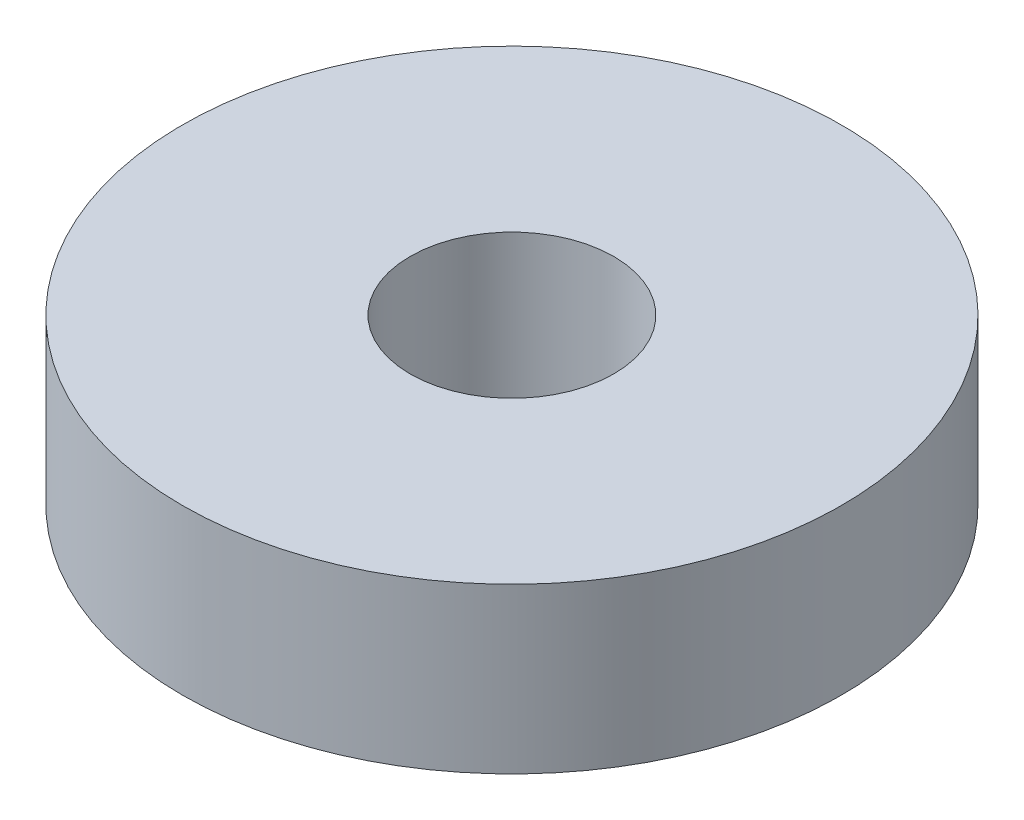
ISO-10303-21;
HEADER;
FILE_DESCRIPTION(('STEP AP214'),'2;1');
FILE_NAME('part.step','',(''),(''),'','','');
FILE_SCHEMA(('AUTOMOTIVE_DESIGN { 1 0 10303 214 1 1 1 1 }'));
ENDSEC;
DATA;
#1=APPLICATION_CONTEXT('core data for automotive mechanical design processes');
#2=APPLICATION_PROTOCOL_DEFINITION('international standard','automotive_design',2000,#1);
#3=PRODUCT_CONTEXT('',#1,'mechanical');
#4=PRODUCT('Part','Part','',(#3));
#5=PRODUCT_RELATED_PRODUCT_CATEGORY('part','',(#4));
#6=PRODUCT_DEFINITION_FORMATION('','',#4);
#7=PRODUCT_DEFINITION_CONTEXT('part definition',#1,'design');
#8=PRODUCT_DEFINITION('design','',#6,#7);
#9=PRODUCT_DEFINITION_SHAPE('','',#8);
#10=(LENGTH_UNIT() NAMED_UNIT(*) SI_UNIT(.MILLI.,.METRE.));
#11=(NAMED_UNIT(*) PLANE_ANGLE_UNIT() SI_UNIT($,.RADIAN.));
#12=(NAMED_UNIT(*) SI_UNIT($,.STERADIAN.) SOLID_ANGLE_UNIT());
#13=UNCERTAINTY_MEASURE_WITH_UNIT(LENGTH_MEASURE(1.E-05),#10,'distance_accuracy_value','');
#14=(GEOMETRIC_REPRESENTATION_CONTEXT(3) GLOBAL_UNCERTAINTY_ASSIGNED_CONTEXT((#13)) GLOBAL_UNIT_ASSIGNED_CONTEXT((#10,
#11,#12)) REPRESENTATION_CONTEXT('',''));
#15=CARTESIAN_POINT('',(0.,0.,0.));
#16=DIRECTION('',(0.,0.,1.));
#17=DIRECTION('',(1.,0.,0.));
#18=AXIS2_PLACEMENT_3D('',#15,#16,#17);
#19=CARTESIAN_POINT('',(0.,10.287,0.));
#20=DIRECTION('',(0.,1.,0.));
#21=DIRECTION('',(0.,0.,1.));
#22=AXIS2_PLACEMENT_3D('',#19,#20,#21);
#23=PLANE('',#22);
#24=CARTESIAN_POINT('',(0.,10.287,0.));
#25=DIRECTION('',(0.,1.,0.));
#26=DIRECTION('',(0.,0.,1.));
#27=AXIS2_PLACEMENT_3D('',#24,#25,#26);
#28=CIRCLE('',#27,20.6375);
#29=CARTESIAN_POINT('',(0.,10.287,20.6375));
#30=VERTEX_POINT('',#29);
#31=EDGE_CURVE('E10',#30,#30,#28,.T.);
#32=ORIENTED_EDGE('',*,*,#31,.T.);
#33=EDGE_LOOP('',(#32));
#34=FACE_BOUND('',#33,.T.);
#35=CARTESIAN_POINT('',(0.,10.287,0.));
#36=DIRECTION('',(0.,1.,0.));
#37=DIRECTION('',(0.,0.,1.));
#38=AXIS2_PLACEMENT_3D('',#35,#36,#37);
#39=CIRCLE('',#38,6.3754);
#40=CARTESIAN_POINT('',(0.,10.287,6.3754));
#41=VERTEX_POINT('',#40);
#42=EDGE_CURVE('E50',#41,#41,#39,.T.);
#43=ORIENTED_EDGE('',*,*,#42,.F.);
#44=EDGE_LOOP('',(#43));
#45=FACE_BOUND('',#44,.T.);
#46=ADVANCED_FACE('F37',(#34,#45),#23,.T.);
#47=CARTESIAN_POINT('',(0.,0.,0.));
#48=DIRECTION('',(0.,1.,0.));
#49=DIRECTION('',(0.,0.,1.));
#50=AXIS2_PLACEMENT_3D('',#47,#48,#49);
#51=PLANE('',#50);
#52=CARTESIAN_POINT('',(0.,0.,0.));
#53=DIRECTION('',(0.,1.,0.));
#54=DIRECTION('',(0.,0.,1.));
#55=AXIS2_PLACEMENT_3D('',#52,#53,#54);
#56=CIRCLE('',#55,20.6375);
#57=CARTESIAN_POINT('',(0.,0.,20.6375));
#58=VERTEX_POINT('',#57);
#59=EDGE_CURVE('E41',#58,#58,#56,.T.);
#60=ORIENTED_EDGE('',*,*,#59,.F.);
#61=EDGE_LOOP('',(#60));
#62=FACE_BOUND('',#61,.T.);
#63=CARTESIAN_POINT('',(0.,0.,0.));
#64=DIRECTION('',(0.,1.,0.));
#65=DIRECTION('',(0.,0.,1.));
#66=AXIS2_PLACEMENT_3D('',#63,#64,#65);
#67=CIRCLE('',#66,6.3754);
#68=CARTESIAN_POINT('',(0.,0.,6.3754));
#69=VERTEX_POINT('',#68);
#70=EDGE_CURVE('E52',#69,#69,#67,.T.);
#71=ORIENTED_EDGE('',*,*,#70,.T.);
#72=EDGE_LOOP('',(#71));
#73=FACE_BOUND('',#72,.T.);
#74=ADVANCED_FACE('F64',(#62,#73),#51,.F.);
#75=CARTESIAN_POINT('',(0.,10.287,0.));
#76=DIRECTION('',(0.,-1.,0.));
#77=DIRECTION('',(0.,0.,-1.));
#78=AXIS2_PLACEMENT_3D('',#75,#76,#77);
#79=CYLINDRICAL_SURFACE('',#78,20.6375);
#80=ORIENTED_EDGE('',*,*,#31,.F.);
#81=EDGE_LOOP('',(#80));
#82=FACE_BOUND('',#81,.T.);
#83=ORIENTED_EDGE('',*,*,#59,.T.);
#84=EDGE_LOOP('',(#83));
#85=FACE_BOUND('',#84,.T.);
#86=ADVANCED_FACE('F39',(#82,#85),#79,.T.);
#87=CARTESIAN_POINT('',(0.,10.287,0.));
#88=DIRECTION('',(0.,-1.,0.));
#89=DIRECTION('',(0.,0.,-1.));
#90=AXIS2_PLACEMENT_3D('',#87,#88,#89);
#91=CYLINDRICAL_SURFACE('',#90,6.3754);
#92=ORIENTED_EDGE('',*,*,#42,.T.);
#93=EDGE_LOOP('',(#92));
#94=FACE_BOUND('',#93,.T.);
#95=ORIENTED_EDGE('',*,*,#70,.F.);
#96=EDGE_LOOP('',(#95));
#97=FACE_BOUND('',#96,.T.);
#98=ADVANCED_FACE('F60',(#94,#97),#91,.F.);
#99=CLOSED_SHELL('',(#46,#74,#86,#98));
#100=MANIFOLD_SOLID_BREP('B2',#99);
#101=ADVANCED_BREP_SHAPE_REPRESENTATION('',(#18,#100),#14);
#102=SHAPE_DEFINITION_REPRESENTATION(#9,#101);
ENDSEC;
END-ISO-10303-21;
